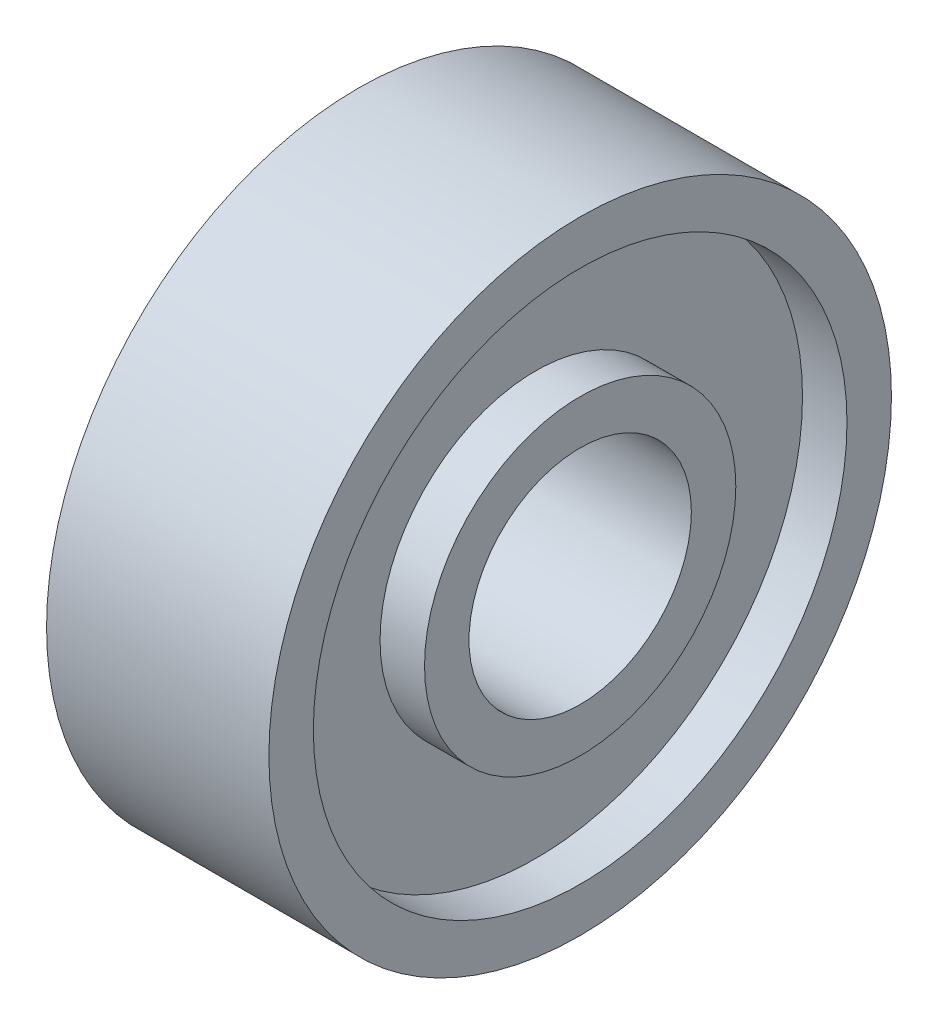
ISO-10303-21;
HEADER;
FILE_DESCRIPTION(('STEP AP214'),'2;1');
FILE_NAME('part.step','',(''),(''),'','','');
FILE_SCHEMA(('AUTOMOTIVE_DESIGN { 1 0 10303 214 1 1 1 1 }'));
ENDSEC;
DATA;
#1=APPLICATION_CONTEXT('core data for automotive mechanical design processes');
#2=APPLICATION_PROTOCOL_DEFINITION('international standard','automotive_design',2000,#1);
#3=PRODUCT_CONTEXT('',#1,'mechanical');
#4=PRODUCT('Part','Part','',(#3));
#5=PRODUCT_RELATED_PRODUCT_CATEGORY('part','',(#4));
#6=PRODUCT_DEFINITION_FORMATION('','',#4);
#7=PRODUCT_DEFINITION_CONTEXT('part definition',#1,'design');
#8=PRODUCT_DEFINITION('design','',#6,#7);
#9=PRODUCT_DEFINITION_SHAPE('','',#8);
#10=(LENGTH_UNIT() NAMED_UNIT(*) SI_UNIT(.MILLI.,.METRE.));
#11=(NAMED_UNIT(*) PLANE_ANGLE_UNIT() SI_UNIT($,.RADIAN.));
#12=(NAMED_UNIT(*) SI_UNIT($,.STERADIAN.) SOLID_ANGLE_UNIT());
#13=UNCERTAINTY_MEASURE_WITH_UNIT(LENGTH_MEASURE(1.E-05),#10,'distance_accuracy_value','');
#14=(GEOMETRIC_REPRESENTATION_CONTEXT(3) GLOBAL_UNCERTAINTY_ASSIGNED_CONTEXT((#13)) GLOBAL_UNIT_ASSIGNED_CONTEXT((#10,
#11,#12)) REPRESENTATION_CONTEXT('',''));
#15=CARTESIAN_POINT('',(0.,0.,0.));
#16=DIRECTION('',(0.,0.,1.));
#17=DIRECTION('',(1.,0.,0.));
#18=AXIS2_PLACEMENT_3D('',#15,#16,#17);
#19=CARTESIAN_POINT('',(-2.49999999999975,2.4980018054066E-13,0.));
#20=DIRECTION('',(1.,0.,0.));
#21=DIRECTION('',(0.,0.,-0.999999999999998));
#22=AXIS2_PLACEMENT_3D('',#19,#20,#21);
#23=PLANE('',#22);
#24=CARTESIAN_POINT('',(-2.49999999999975,2.4980018054066E-13,0.));
#25=DIRECTION('',(1.,0.,0.));
#26=DIRECTION('',(0.,0.,-0.999999999999998));
#27=AXIS2_PLACEMENT_3D('',#24,#25,#26);
#28=CIRCLE('',#27,2.5);
#29=CARTESIAN_POINT('',(-2.49999999999975,2.44387843295613E-13,-2.50000000000003));
#30=VERTEX_POINT('',#29);
#31=EDGE_CURVE('E51',#30,#30,#28,.T.);
#32=ORIENTED_EDGE('',*,*,#31,.T.);
#33=EDGE_LOOP('',(#32));
#34=FACE_BOUND('',#33,.T.);
#35=CARTESIAN_POINT('',(-2.49999999999975,2.4980018054066E-13,0.));
#36=DIRECTION('',(-1.,0.,0.));
#37=DIRECTION('',(0.,0.,0.999999999999998));
#38=AXIS2_PLACEMENT_3D('',#35,#36,#37);
#39=CIRCLE('',#38,3.5);
#40=CARTESIAN_POINT('',(-2.49999999999975,2.57377452683727E-13,3.49999999999996));
#41=VERTEX_POINT('',#40);
#42=EDGE_CURVE('E75',#41,#41,#39,.T.);
#43=ORIENTED_EDGE('',*,*,#42,.T.);
#44=EDGE_LOOP('',(#43));
#45=FACE_BOUND('',#44,.T.);
#46=ADVANCED_FACE('F38',(#34,#45),#23,.F.);
#47=CARTESIAN_POINT('',(2.50000000000025,0.,0.));
#48=DIRECTION('',(1.,0.,0.));
#49=DIRECTION('',(0.,0.,-0.999999999999998));
#50=AXIS2_PLACEMENT_3D('',#47,#48,#49);
#51=PLANE('',#50);
#52=CARTESIAN_POINT('',(2.50000000000025,0.,0.));
#53=DIRECTION('',(1.,0.,0.));
#54=DIRECTION('',(0.,0.,-0.999999999999998));
#55=AXIS2_PLACEMENT_3D('',#52,#53,#54);
#56=CIRCLE('',#55,2.5);
#57=CARTESIAN_POINT('',(2.50000000000025,0.,-2.5));
#58=VERTEX_POINT('',#57);
#59=EDGE_CURVE('E49',#58,#58,#56,.T.);
#60=ORIENTED_EDGE('',*,*,#59,.F.);
#61=EDGE_LOOP('',(#60));
#62=FACE_BOUND('',#61,.T.);
#63=CARTESIAN_POINT('',(2.50000000000025,0.,0.));
#64=DIRECTION('',(1.,0.,0.));
#65=DIRECTION('',(0.,0.,-0.999999999999998));
#66=AXIS2_PLACEMENT_3D('',#63,#64,#65);
#67=CIRCLE('',#66,3.5);
#68=CARTESIAN_POINT('',(2.50000000000025,0.,-3.49999999999999));
#69=VERTEX_POINT('',#68);
#70=EDGE_CURVE('E63',#69,#69,#67,.T.);
#71=ORIENTED_EDGE('',*,*,#70,.T.);
#72=EDGE_LOOP('',(#71));
#73=FACE_BOUND('',#72,.T.);
#74=ADVANCED_FACE('F113',(#62,#73),#51,.T.);
#75=CARTESIAN_POINT('',(2.50000000000025,0.,0.));
#76=DIRECTION('',(1.,0.,0.));
#77=DIRECTION('',(0.,0.,-0.999999999999998));
#78=AXIS2_PLACEMENT_3D('',#75,#76,#77);
#79=CIRCLE('',#78,6.);
#80=CARTESIAN_POINT('',(2.50000000000025,0.,-5.99999999999999));
#81=VERTEX_POINT('',#80);
#82=EDGE_CURVE('E57',#81,#81,#79,.T.);
#83=ORIENTED_EDGE('',*,*,#82,.F.);
#84=EDGE_LOOP('',(#83));
#85=FACE_BOUND('',#84,.T.);
#86=CARTESIAN_POINT('',(2.50000000000025,0.,0.));
#87=DIRECTION('',(1.,0.,0.));
#88=DIRECTION('',(0.,0.,-0.999999999999998));
#89=AXIS2_PLACEMENT_3D('',#86,#87,#88);
#90=CIRCLE('',#89,7.);
#91=CARTESIAN_POINT('',(2.50000000000025,0.,-6.99999999999999));
#92=VERTEX_POINT('',#91);
#93=EDGE_CURVE('E10',#92,#92,#90,.T.);
#94=ORIENTED_EDGE('',*,*,#93,.T.);
#95=EDGE_LOOP('',(#94));
#96=FACE_BOUND('',#95,.T.);
#97=ADVANCED_FACE('F100',(#85,#96),#51,.T.);
#98=CARTESIAN_POINT('',(-2.49999999999975,2.4980018054066E-13,0.));
#99=DIRECTION('',(-1.,0.,0.));
#100=DIRECTION('',(0.,0.,0.999999999999998));
#101=AXIS2_PLACEMENT_3D('',#98,#99,#100);
#102=CIRCLE('',#101,4.5);
#103=CARTESIAN_POINT('',(-2.49999999999975,2.59542387581746E-13,4.49999999999996));
#104=VERTEX_POINT('',#103);
#105=EDGE_CURVE('E69',#104,#104,#102,.T.);
#106=ORIENTED_EDGE('',*,*,#105,.F.);
#107=EDGE_LOOP('',(#106));
#108=FACE_BOUND('',#107,.T.);
#109=CARTESIAN_POINT('',(-2.49999999999975,2.4980018054066E-13,0.));
#110=DIRECTION('',(1.,0.,0.));
#111=DIRECTION('',(0.,0.,-0.999999999999998));
#112=AXIS2_PLACEMENT_3D('',#109,#110,#111);
#113=CIRCLE('',#112,7.);
#114=CARTESIAN_POINT('',(-2.49999999999975,2.34645636254527E-13,-7.00000000000002));
#115=VERTEX_POINT('',#114);
#116=EDGE_CURVE('E42',#115,#115,#113,.T.);
#117=ORIENTED_EDGE('',*,*,#116,.F.);
#118=EDGE_LOOP('',(#117));
#119=FACE_BOUND('',#118,.T.);
#120=ADVANCED_FACE('F97',(#108,#119),#23,.F.);
#121=CARTESIAN_POINT('',(2.50000000000025,0.,0.));
#122=DIRECTION('',(-1.,0.,0.));
#123=DIRECTION('',(0.,0.,0.999999999999998));
#124=AXIS2_PLACEMENT_3D('',#121,#122,#123);
#125=CYLINDRICAL_SURFACE('',#124,7.);
#126=ORIENTED_EDGE('',*,*,#93,.F.);
#127=EDGE_LOOP('',(#126));
#128=FACE_BOUND('',#127,.T.);
#129=ORIENTED_EDGE('',*,*,#116,.T.);
#130=EDGE_LOOP('',(#129));
#131=FACE_BOUND('',#130,.T.);
#132=ADVANCED_FACE('F40',(#128,#131),#125,.T.);
#133=CARTESIAN_POINT('',(2.50000000000025,0.,0.));
#134=DIRECTION('',(-1.,0.,0.));
#135=DIRECTION('',(0.,0.,0.999999999999998));
#136=AXIS2_PLACEMENT_3D('',#133,#134,#135);
#137=CYLINDRICAL_SURFACE('',#136,2.5);
#138=ORIENTED_EDGE('',*,*,#59,.T.);
#139=EDGE_LOOP('',(#138));
#140=FACE_BOUND('',#139,.T.);
#141=ORIENTED_EDGE('',*,*,#31,.F.);
#142=EDGE_LOOP('',(#141));
#143=FACE_BOUND('',#142,.T.);
#144=ADVANCED_FACE('F104',(#140,#143),#137,.F.);
#145=CARTESIAN_POINT('',(1.50000000000025,3.05311331771918E-13,0.));
#146=DIRECTION('',(1.,0.,0.));
#147=DIRECTION('',(0.,0.,-0.999999999999998));
#148=AXIS2_PLACEMENT_3D('',#145,#146,#147);
#149=CYLINDRICAL_SURFACE('',#148,6.);
#150=CARTESIAN_POINT('',(1.50000000000025,3.05311331771918E-13,0.));
#151=DIRECTION('',(1.,0.,0.));
#152=DIRECTION('',(0.,0.,-0.999999999999998));
#153=AXIS2_PLACEMENT_3D('',#150,#151,#152);
#154=CIRCLE('',#153,6.);
#155=CARTESIAN_POINT('',(1.50000000000025,2.92321722383804E-13,-6.00000000000007));
#156=VERTEX_POINT('',#155);
#157=EDGE_CURVE('E54',#156,#156,#154,.T.);
#158=ORIENTED_EDGE('',*,*,#157,.F.);
#159=EDGE_LOOP('',(#158));
#160=FACE_BOUND('',#159,.T.);
#161=ORIENTED_EDGE('',*,*,#82,.T.);
#162=EDGE_LOOP('',(#161));
#163=FACE_BOUND('',#162,.T.);
#164=ADVANCED_FACE('F109',(#160,#163),#149,.F.);
#165=CARTESIAN_POINT('',(1.50000000000025,3.05311331771918E-13,0.));
#166=DIRECTION('',(1.,0.,0.));
#167=DIRECTION('',(0.,0.,-0.999999999999998));
#168=AXIS2_PLACEMENT_3D('',#165,#166,#167);
#169=PLANE('',#168);
#170=CARTESIAN_POINT('',(1.50000000000025,3.05311331771918E-13,0.));
#171=DIRECTION('',(1.,0.,0.));
#172=DIRECTION('',(0.,0.,-0.999999999999998));
#173=AXIS2_PLACEMENT_3D('',#170,#171,#172);
#174=CIRCLE('',#173,3.5);
#175=CARTESIAN_POINT('',(1.50000000000025,2.97734059628851E-13,-3.50000000000008));
#176=VERTEX_POINT('',#175);
#177=EDGE_CURVE('E60',#176,#176,#174,.T.);
#178=ORIENTED_EDGE('',*,*,#177,.F.);
#179=EDGE_LOOP('',(#178));
#180=FACE_BOUND('',#179,.T.);
#181=ORIENTED_EDGE('',*,*,#157,.T.);
#182=EDGE_LOOP('',(#181));
#183=FACE_BOUND('',#182,.T.);
#184=ADVANCED_FACE('F126',(#180,#183),#169,.T.);
#185=CARTESIAN_POINT('',(1.50000000000025,3.05311331771918E-13,0.));
#186=DIRECTION('',(1.,0.,0.));
#187=DIRECTION('',(0.,0.,-0.999999999999998));
#188=AXIS2_PLACEMENT_3D('',#185,#186,#187);
#189=CYLINDRICAL_SURFACE('',#188,3.5);
#190=ORIENTED_EDGE('',*,*,#177,.T.);
#191=EDGE_LOOP('',(#190));
#192=FACE_BOUND('',#191,.T.);
#193=ORIENTED_EDGE('',*,*,#70,.F.);
#194=EDGE_LOOP('',(#193));
#195=FACE_BOUND('',#194,.T.);
#196=ADVANCED_FACE('F93',(#192,#195),#189,.T.);
#197=CARTESIAN_POINT('',(-1.4999999999998,4.44089209850063E-13,0.));
#198=DIRECTION('',(-1.,0.,0.));
#199=DIRECTION('',(0.,0.,0.999999999999998));
#200=AXIS2_PLACEMENT_3D('',#197,#198,#199);
#201=CYLINDRICAL_SURFACE('',#200,4.5);
#202=CARTESIAN_POINT('',(-1.4999999999998,4.44089209850063E-13,0.));
#203=DIRECTION('',(-1.,0.,0.));
#204=DIRECTION('',(0.,0.,0.999999999999998));
#205=AXIS2_PLACEMENT_3D('',#202,#203,#204);
#206=CIRCLE('',#205,4.5);
#207=CARTESIAN_POINT('',(-1.4999999999998,4.53831416891148E-13,4.49999999999999));
#208=VERTEX_POINT('',#207);
#209=EDGE_CURVE('E66',#208,#208,#206,.T.);
#210=ORIENTED_EDGE('',*,*,#209,.F.);
#211=EDGE_LOOP('',(#210));
#212=FACE_BOUND('',#211,.T.);
#213=ORIENTED_EDGE('',*,*,#105,.T.);
#214=EDGE_LOOP('',(#213));
#215=FACE_BOUND('',#214,.T.);
#216=ADVANCED_FACE('F87',(#212,#215),#201,.F.);
#217=CARTESIAN_POINT('',(-1.4999999999998,4.44089209850063E-13,0.));
#218=DIRECTION('',(-1.,0.,0.));
#219=DIRECTION('',(0.,0.,0.999999999999998));
#220=AXIS2_PLACEMENT_3D('',#217,#218,#219);
#221=PLANE('',#220);
#222=CARTESIAN_POINT('',(-1.4999999999998,4.44089209850063E-13,0.));
#223=DIRECTION('',(-1.,0.,0.));
#224=DIRECTION('',(0.,0.,0.999999999999998));
#225=AXIS2_PLACEMENT_3D('',#222,#223,#224);
#226=CIRCLE('',#225,3.5);
#227=CARTESIAN_POINT('',(-1.4999999999998,4.51666481993129E-13,3.49999999999999));
#228=VERTEX_POINT('',#227);
#229=EDGE_CURVE('E72',#228,#228,#226,.T.);
#230=ORIENTED_EDGE('',*,*,#229,.F.);
#231=EDGE_LOOP('',(#230));
#232=FACE_BOUND('',#231,.T.);
#233=ORIENTED_EDGE('',*,*,#209,.T.);
#234=EDGE_LOOP('',(#233));
#235=FACE_BOUND('',#234,.T.);
#236=ADVANCED_FACE('F84',(#232,#235),#221,.T.);
#237=CARTESIAN_POINT('',(-1.4999999999998,4.44089209850063E-13,0.));
#238=DIRECTION('',(-1.,0.,0.));
#239=DIRECTION('',(0.,0.,0.999999999999998));
#240=AXIS2_PLACEMENT_3D('',#237,#238,#239);
#241=CYLINDRICAL_SURFACE('',#240,3.5);
#242=ORIENTED_EDGE('',*,*,#229,.T.);
#243=EDGE_LOOP('',(#242));
#244=FACE_BOUND('',#243,.T.);
#245=ORIENTED_EDGE('',*,*,#42,.F.);
#246=EDGE_LOOP('',(#245));
#247=FACE_BOUND('',#246,.T.);
#248=ADVANCED_FACE('F81',(#244,#247),#241,.T.);
#249=CLOSED_SHELL('',(#46,#74,#97,#120,#132,#144,#164,#184,#196,#216,#236,#248));
#250=MANIFOLD_SOLID_BREP('B2',#249);
#251=ADVANCED_BREP_SHAPE_REPRESENTATION('',(#18,#250),#14);
#252=SHAPE_DEFINITION_REPRESENTATION(#9,#251);
ENDSEC;
END-ISO-10303-21;
